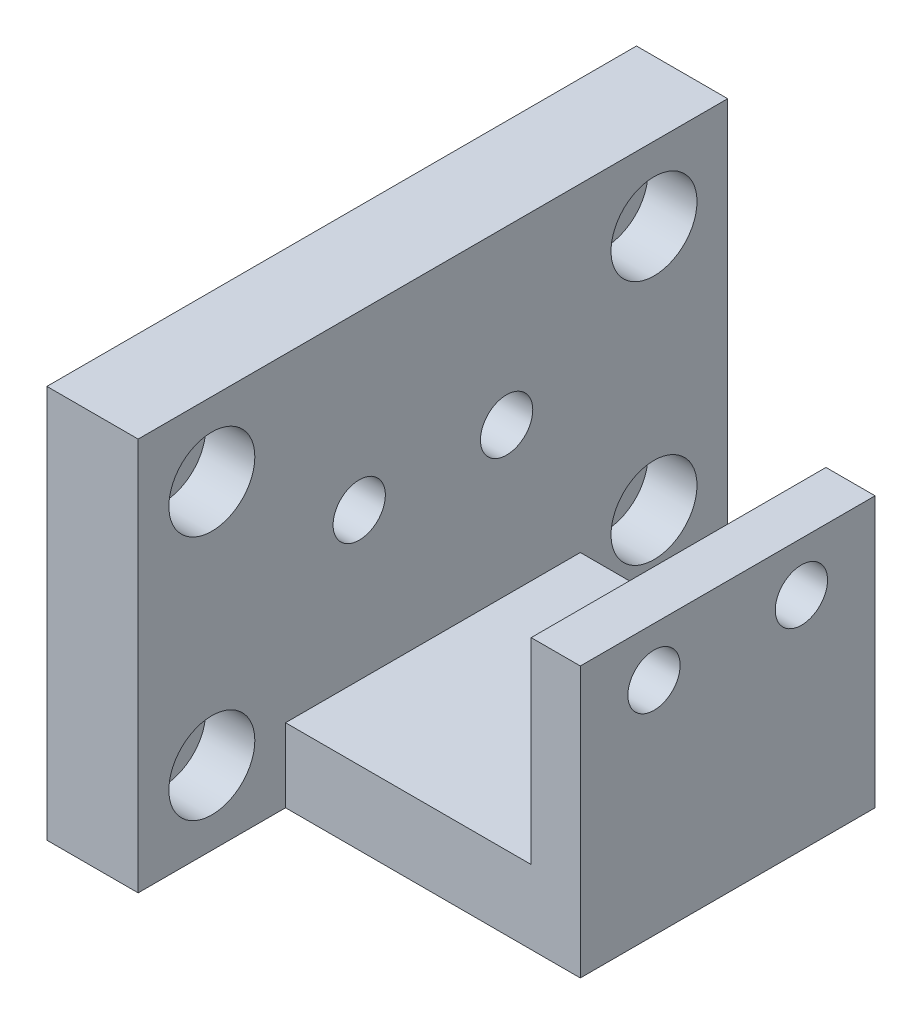
ISO-10303-21;
HEADER;
FILE_DESCRIPTION(('STEP AP214'),'2;1');
FILE_NAME('part.step','',(''),(''),'','','');
FILE_SCHEMA(('AUTOMOTIVE_DESIGN { 1 0 10303 214 1 1 1 1 }'));
ENDSEC;
DATA;
#1=APPLICATION_CONTEXT('core data for automotive mechanical design processes');
#2=APPLICATION_PROTOCOL_DEFINITION('international standard','automotive_design',2000,#1);
#3=PRODUCT_CONTEXT('',#1,'mechanical');
#4=PRODUCT('Part','Part','',(#3));
#5=PRODUCT_RELATED_PRODUCT_CATEGORY('part','',(#4));
#6=PRODUCT_DEFINITION_FORMATION('','',#4);
#7=PRODUCT_DEFINITION_CONTEXT('part definition',#1,'design');
#8=PRODUCT_DEFINITION('design','',#6,#7);
#9=PRODUCT_DEFINITION_SHAPE('','',#8);
#10=(LENGTH_UNIT() NAMED_UNIT(*) SI_UNIT(.MILLI.,.METRE.));
#11=(NAMED_UNIT(*) PLANE_ANGLE_UNIT() SI_UNIT($,.RADIAN.));
#12=(NAMED_UNIT(*) SI_UNIT($,.STERADIAN.) SOLID_ANGLE_UNIT());
#13=UNCERTAINTY_MEASURE_WITH_UNIT(LENGTH_MEASURE(1.E-05),#10,'distance_accuracy_value','');
#14=(GEOMETRIC_REPRESENTATION_CONTEXT(3) GLOBAL_UNCERTAINTY_ASSIGNED_CONTEXT((#13)) GLOBAL_UNIT_ASSIGNED_CONTEXT((#10,
#11,#12)) REPRESENTATION_CONTEXT('',''));
#15=CARTESIAN_POINT('',(0.,0.,0.));
#16=DIRECTION('',(0.,0.,1.));
#17=DIRECTION('',(1.,0.,0.));
#18=AXIS2_PLACEMENT_3D('',#15,#16,#17);
#19=CARTESIAN_POINT('',(11.7926903796541,0.,0.));
#20=DIRECTION('',(-1.,0.,0.));
#21=DIRECTION('',(0.,0.,1.));
#22=AXIS2_PLACEMENT_3D('',#19,#20,#21);
#23=PLANE('',#22);
#24=CARTESIAN_POINT('',(11.7926903796541,15.875,28.575));
#25=DIRECTION('',(1.,0.,0.));
#26=DIRECTION('',(0.,0.,-1.));
#27=AXIS2_PLACEMENT_3D('',#24,#25,#26);
#28=CIRCLE('',#27,5.55625);
#29=CARTESIAN_POINT('',(11.7926903796541,15.875,23.01875));
#30=VERTEX_POINT('',#29);
#31=EDGE_CURVE('E511',#30,#30,#28,.T.);
#32=ORIENTED_EDGE('',*,*,#31,.F.);
#33=EDGE_LOOP('',(#32));
#34=FACE_BOUND('',#33,.T.);
#35=CARTESIAN_POINT('',(11.7926903796541,15.875,-28.575));
#36=DIRECTION('',(1.,0.,0.));
#37=DIRECTION('',(0.,0.,-1.));
#38=AXIS2_PLACEMENT_3D('',#35,#36,#37);
#39=CIRCLE('',#38,5.55625);
#40=CARTESIAN_POINT('',(11.7926903796541,15.875,-34.13125));
#41=VERTEX_POINT('',#40);
#42=EDGE_CURVE('E521',#41,#41,#39,.T.);
#43=ORIENTED_EDGE('',*,*,#42,.F.);
#44=EDGE_LOOP('',(#43));
#45=FACE_BOUND('',#44,.T.);
#46=CARTESIAN_POINT('',(11.7926903796541,-15.875,-28.575));
#47=DIRECTION('',(1.,0.,0.));
#48=DIRECTION('',(0.,0.,-1.));
#49=AXIS2_PLACEMENT_3D('',#46,#47,#48);
#50=CIRCLE('',#49,5.55625);
#51=CARTESIAN_POINT('',(11.7926903796541,-15.875,-34.13125));
#52=VERTEX_POINT('',#51);
#53=EDGE_CURVE('E533',#52,#52,#50,.T.);
#54=ORIENTED_EDGE('',*,*,#53,.F.);
#55=EDGE_LOOP('',(#54));
#56=FACE_BOUND('',#55,.T.);
#57=CARTESIAN_POINT('',(11.7926903796541,3.175,9.525));
#58=DIRECTION('',(-1.,0.,0.));
#59=DIRECTION('',(0.,0.,1.));
#60=AXIS2_PLACEMENT_3D('',#57,#58,#59);
#61=CIRCLE('',#60,3.37819999999999);
#62=CARTESIAN_POINT('',(11.7926903796541,3.175,12.9032));
#63=VERTEX_POINT('',#62);
#64=EDGE_CURVE('E566',#63,#63,#61,.T.);
#65=ORIENTED_EDGE('',*,*,#64,.T.);
#66=EDGE_LOOP('',(#65));
#67=FACE_BOUND('',#66,.T.);
#68=CARTESIAN_POINT('',(11.7926903796541,3.175,-9.525));
#69=DIRECTION('',(-1.,0.,0.));
#70=DIRECTION('',(0.,0.,1.));
#71=AXIS2_PLACEMENT_3D('',#68,#69,#70);
#72=CIRCLE('',#71,3.37819999999999);
#73=CARTESIAN_POINT('',(11.7926903796541,3.175,-6.14680000000001));
#74=VERTEX_POINT('',#73);
#75=EDGE_CURVE('E575',#74,#74,#72,.T.);
#76=ORIENTED_EDGE('',*,*,#75,.T.);
#77=EDGE_LOOP('',(#76));
#78=FACE_BOUND('',#77,.T.);
#79=DIRECTION('',(0.,-1.,0.));
#80=VECTOR('',#79,1.);
#81=CARTESIAN_POINT('',(11.7926903796541,-15.875,19.05));
#82=LINE('',#81,#80);
#83=CARTESIAN_POINT('',(11.7926903796541,-15.875,19.05));
#84=VERTEX_POINT('',#83);
#85=CARTESIAN_POINT('',(11.7926903796541,-25.4,19.05));
#86=VERTEX_POINT('',#85);
#87=EDGE_CURVE('E152',#84,#86,#82,.T.);
#88=ORIENTED_EDGE('',*,*,#87,.F.);
#89=DIRECTION('',(0.,0.,1.));
#90=VECTOR('',#89,1.);
#91=CARTESIAN_POINT('',(11.7926903796541,-15.875,-19.05));
#92=LINE('',#91,#90);
#93=CARTESIAN_POINT('',(11.7926903796541,-15.875,-19.05));
#94=VERTEX_POINT('',#93);
#95=EDGE_CURVE('E167',#94,#84,#92,.T.);
#96=ORIENTED_EDGE('',*,*,#95,.F.);
#97=DIRECTION('',(0.,-1.,0.));
#98=VECTOR('',#97,1.);
#99=CARTESIAN_POINT('',(11.7926903796541,-15.875,-19.05));
#100=LINE('',#99,#98);
#101=CARTESIAN_POINT('',(11.7926903796541,-25.4,-19.05));
#102=VERTEX_POINT('',#101);
#103=EDGE_CURVE('E140',#94,#102,#100,.T.);
#104=ORIENTED_EDGE('',*,*,#103,.T.);
#105=DIRECTION('',(0.,0.,-1.));
#106=VECTOR('',#105,1.);
#107=CARTESIAN_POINT('',(11.7926903796541,-25.4,38.1));
#108=LINE('',#107,#106);
#109=CARTESIAN_POINT('',(11.7926903796541,-25.4,-38.1));
#110=VERTEX_POINT('',#109);
#111=EDGE_CURVE('E60',#102,#110,#108,.T.);
#112=ORIENTED_EDGE('',*,*,#111,.T.);
#113=DIRECTION('',(0.,1.,0.));
#114=VECTOR('',#113,1.);
#115=CARTESIAN_POINT('',(11.7926903796541,-25.4,-38.1));
#116=LINE('',#115,#114);
#117=CARTESIAN_POINT('',(11.7926903796541,25.4,-38.1));
#118=VERTEX_POINT('',#117);
#119=EDGE_CURVE('E175',#110,#118,#116,.T.);
#120=ORIENTED_EDGE('',*,*,#119,.T.);
#121=DIRECTION('',(0.,0.,1.));
#122=VECTOR('',#121,1.);
#123=CARTESIAN_POINT('',(11.7926903796541,25.4,38.1));
#124=LINE('',#123,#122);
#125=CARTESIAN_POINT('',(11.7926903796541,25.4,38.1));
#126=VERTEX_POINT('',#125);
#127=EDGE_CURVE('E89',#118,#126,#124,.T.);
#128=ORIENTED_EDGE('',*,*,#127,.T.);
#129=DIRECTION('',(0.,-1.,0.));
#130=VECTOR('',#129,1.);
#131=CARTESIAN_POINT('',(11.7926903796541,-25.4,38.1));
#132=LINE('',#131,#130);
#133=CARTESIAN_POINT('',(11.7926903796541,-25.4,38.1));
#134=VERTEX_POINT('',#133);
#135=EDGE_CURVE('E178',#126,#134,#132,.T.);
#136=ORIENTED_EDGE('',*,*,#135,.T.);
#137=EDGE_CURVE('E180',#134,#86,#108,.T.);
#138=ORIENTED_EDGE('',*,*,#137,.T.);
#139=EDGE_LOOP('',(#88,#96,#104,#112,#120,#128,#136,#138));
#140=FACE_BOUND('',#139,.T.);
#141=CARTESIAN_POINT('',(11.7926903796541,-15.875,28.575));
#142=DIRECTION('',(1.,0.,0.));
#143=DIRECTION('',(0.,0.,-1.));
#144=AXIS2_PLACEMENT_3D('',#141,#142,#143);
#145=CIRCLE('',#144,5.55625);
#146=CARTESIAN_POINT('',(11.7926903796541,-15.875,23.01875));
#147=VERTEX_POINT('',#146);
#148=EDGE_CURVE('E545',#147,#147,#145,.T.);
#149=ORIENTED_EDGE('',*,*,#148,.F.);
#150=EDGE_LOOP('',(#149));
#151=FACE_BOUND('',#150,.T.);
#152=ADVANCED_FACE('F37',(#34,#45,#56,#67,#78,#140,#151),#23,.F.);
#153=CARTESIAN_POINT('',(11.7926903796541,-25.4,-38.1));
#154=DIRECTION('',(0.,0.,1.));
#155=DIRECTION('',(1.,0.,0.));
#156=AXIS2_PLACEMENT_3D('',#153,#154,#155);
#157=PLANE('',#156);
#158=DIRECTION('',(0.,1.,0.));
#159=VECTOR('',#158,1.);
#160=CARTESIAN_POINT('',(0.,-25.4,-38.1));
#161=LINE('',#160,#159);
#162=CARTESIAN_POINT('',(0.,-25.4,-38.1));
#163=VERTEX_POINT('',#162);
#164=CARTESIAN_POINT('',(0.,25.4,-38.1));
#165=VERTEX_POINT('',#164);
#166=EDGE_CURVE('E169',#163,#165,#161,.T.);
#167=ORIENTED_EDGE('',*,*,#166,.T.);
#168=DIRECTION('',(-1.,0.,0.));
#169=VECTOR('',#168,1.);
#170=CARTESIAN_POINT('',(11.7926903796541,25.4,-38.1));
#171=LINE('',#170,#169);
#172=EDGE_CURVE('E11',#118,#165,#171,.T.);
#173=ORIENTED_EDGE('',*,*,#172,.F.);
#174=ORIENTED_EDGE('',*,*,#119,.F.);
#175=DIRECTION('',(-1.,0.,0.));
#176=VECTOR('',#175,1.);
#177=CARTESIAN_POINT('',(11.7926903796541,-25.4,-38.1));
#178=LINE('',#177,#176);
#179=EDGE_CURVE('E183',#110,#163,#178,.T.);
#180=ORIENTED_EDGE('',*,*,#179,.T.);
#181=EDGE_LOOP('',(#167,#173,#174,#180));
#182=FACE_BOUND('',#181,.T.);
#183=ADVANCED_FACE('F39',(#182),#157,.F.);
#184=CARTESIAN_POINT('',(11.7926903796541,25.4,38.1));
#185=DIRECTION('',(0.,-1.,0.));
#186=DIRECTION('',(0.,0.,-1.));
#187=AXIS2_PLACEMENT_3D('',#184,#185,#186);
#188=PLANE('',#187);
#189=DIRECTION('',(0.,0.,1.));
#190=VECTOR('',#189,1.);
#191=CARTESIAN_POINT('',(0.,25.4,38.1));
#192=LINE('',#191,#190);
#193=CARTESIAN_POINT('',(0.,25.4,38.1));
#194=VERTEX_POINT('',#193);
#195=EDGE_CURVE('E186',#165,#194,#192,.T.);
#196=ORIENTED_EDGE('',*,*,#195,.T.);
#197=DIRECTION('',(-1.,0.,0.));
#198=VECTOR('',#197,1.);
#199=CARTESIAN_POINT('',(11.7926903796541,25.4,38.1));
#200=LINE('',#199,#198);
#201=EDGE_CURVE('E45',#126,#194,#200,.T.);
#202=ORIENTED_EDGE('',*,*,#201,.F.);
#203=ORIENTED_EDGE('',*,*,#127,.F.);
#204=ORIENTED_EDGE('',*,*,#172,.T.);
#205=EDGE_LOOP('',(#196,#202,#203,#204));
#206=FACE_BOUND('',#205,.T.);
#207=ADVANCED_FACE('F238',(#206),#188,.F.);
#208=CARTESIAN_POINT('',(11.7926903796541,-25.4,38.1));
#209=DIRECTION('',(0.,0.,-1.));
#210=DIRECTION('',(-1.,0.,0.));
#211=AXIS2_PLACEMENT_3D('',#208,#209,#210);
#212=PLANE('',#211);
#213=DIRECTION('',(0.,-1.,0.));
#214=VECTOR('',#213,1.);
#215=CARTESIAN_POINT('',(0.,-25.4,38.1));
#216=LINE('',#215,#214);
#217=CARTESIAN_POINT('',(0.,-25.4,38.1));
#218=VERTEX_POINT('',#217);
#219=EDGE_CURVE('E188',#194,#218,#216,.T.);
#220=ORIENTED_EDGE('',*,*,#219,.T.);
#221=DIRECTION('',(-1.,0.,0.));
#222=VECTOR('',#221,1.);
#223=CARTESIAN_POINT('',(11.7926903796541,-25.4,38.1));
#224=LINE('',#223,#222);
#225=EDGE_CURVE('E192',#134,#218,#224,.T.);
#226=ORIENTED_EDGE('',*,*,#225,.F.);
#227=ORIENTED_EDGE('',*,*,#135,.F.);
#228=ORIENTED_EDGE('',*,*,#201,.T.);
#229=EDGE_LOOP('',(#220,#226,#227,#228));
#230=FACE_BOUND('',#229,.T.);
#231=ADVANCED_FACE('F197',(#230),#212,.F.);
#232=CARTESIAN_POINT('',(11.7926903796541,-25.4,38.1));
#233=DIRECTION('',(0.,1.,0.));
#234=DIRECTION('',(0.,0.,1.));
#235=AXIS2_PLACEMENT_3D('',#232,#233,#234);
#236=PLANE('',#235);
#237=DIRECTION('',(0.,0.,-1.));
#238=VECTOR('',#237,1.);
#239=CARTESIAN_POINT('',(0.,-25.4,38.1));
#240=LINE('',#239,#238);
#241=EDGE_CURVE('E82',#218,#163,#240,.T.);
#242=ORIENTED_EDGE('',*,*,#241,.T.);
#243=ORIENTED_EDGE('',*,*,#179,.F.);
#244=ORIENTED_EDGE('',*,*,#111,.F.);
#245=DIRECTION('',(1.,0.,0.));
#246=VECTOR('',#245,1.);
#247=CARTESIAN_POINT('',(11.7926903796541,-25.4,-19.05));
#248=LINE('',#247,#246);
#249=CARTESIAN_POINT('',(49.8926903796541,-25.4,-19.05));
#250=VERTEX_POINT('',#249);
#251=EDGE_CURVE('E52',#102,#250,#248,.T.);
#252=ORIENTED_EDGE('',*,*,#251,.T.);
#253=DIRECTION('',(0.,0.,1.));
#254=VECTOR('',#253,1.);
#255=CARTESIAN_POINT('',(49.8926903796541,-25.4,-19.05));
#256=LINE('',#255,#254);
#257=CARTESIAN_POINT('',(49.8926903796541,-25.4,19.05));
#258=VERTEX_POINT('',#257);
#259=EDGE_CURVE('E124',#250,#258,#256,.T.);
#260=ORIENTED_EDGE('',*,*,#259,.T.);
#261=DIRECTION('',(1.,0.,0.));
#262=VECTOR('',#261,1.);
#263=CARTESIAN_POINT('',(11.7926903796541,-25.4,19.05));
#264=LINE('',#263,#262);
#265=EDGE_CURVE('E155',#86,#258,#264,.T.);
#266=ORIENTED_EDGE('',*,*,#265,.F.);
#267=ORIENTED_EDGE('',*,*,#137,.F.);
#268=ORIENTED_EDGE('',*,*,#225,.T.);
#269=EDGE_LOOP('',(#242,#243,#244,#252,#260,#266,#267,#268));
#270=FACE_BOUND('',#269,.T.);
#271=ADVANCED_FACE('F139',(#270),#236,.F.);
#272=CARTESIAN_POINT('',(0.,0.,0.));
#273=DIRECTION('',(-1.,0.,0.));
#274=DIRECTION('',(0.,0.,1.));
#275=AXIS2_PLACEMENT_3D('',#272,#273,#274);
#276=PLANE('',#275);
#277=CARTESIAN_POINT('',(0.,15.875,28.575));
#278=DIRECTION('',(1.,0.,0.));
#279=DIRECTION('',(0.,0.,-1.));
#280=AXIS2_PLACEMENT_3D('',#277,#278,#279);
#281=CIRCLE('',#280,3.3782);
#282=CARTESIAN_POINT('',(0.,15.875,25.1968));
#283=VERTEX_POINT('',#282);
#284=EDGE_CURVE('E518',#283,#283,#281,.T.);
#285=ORIENTED_EDGE('',*,*,#284,.T.);
#286=EDGE_LOOP('',(#285));
#287=FACE_BOUND('',#286,.T.);
#288=CARTESIAN_POINT('',(0.,15.875,-28.575));
#289=DIRECTION('',(1.,0.,0.));
#290=DIRECTION('',(0.,0.,-1.));
#291=AXIS2_PLACEMENT_3D('',#288,#289,#290);
#292=CIRCLE('',#291,3.3782);
#293=CARTESIAN_POINT('',(0.,15.875,-31.9532));
#294=VERTEX_POINT('',#293);
#295=EDGE_CURVE('E530',#294,#294,#292,.T.);
#296=ORIENTED_EDGE('',*,*,#295,.T.);
#297=EDGE_LOOP('',(#296));
#298=FACE_BOUND('',#297,.T.);
#299=CARTESIAN_POINT('',(0.,-15.875,-28.575));
#300=DIRECTION('',(1.,0.,0.));
#301=DIRECTION('',(0.,0.,-1.));
#302=AXIS2_PLACEMENT_3D('',#299,#300,#301);
#303=CIRCLE('',#302,3.3782);
#304=CARTESIAN_POINT('',(0.,-15.875,-31.9532));
#305=VERTEX_POINT('',#304);
#306=EDGE_CURVE('E542',#305,#305,#303,.T.);
#307=ORIENTED_EDGE('',*,*,#306,.T.);
#308=EDGE_LOOP('',(#307));
#309=FACE_BOUND('',#308,.T.);
#310=CARTESIAN_POINT('',(0.,-15.875,28.575));
#311=DIRECTION('',(1.,0.,0.));
#312=DIRECTION('',(0.,0.,-1.));
#313=AXIS2_PLACEMENT_3D('',#310,#311,#312);
#314=CIRCLE('',#313,3.3782);
#315=CARTESIAN_POINT('',(0.,-15.875,25.1968));
#316=VERTEX_POINT('',#315);
#317=EDGE_CURVE('E554',#316,#316,#314,.T.);
#318=ORIENTED_EDGE('',*,*,#317,.T.);
#319=EDGE_LOOP('',(#318));
#320=FACE_BOUND('',#319,.T.);
#321=CARTESIAN_POINT('',(0.,3.175,9.525));
#322=DIRECTION('',(1.,0.,0.));
#323=DIRECTION('',(0.,0.,-1.));
#324=AXIS2_PLACEMENT_3D('',#321,#322,#323);
#325=CIRCLE('',#324,3.37819999999999);
#326=CARTESIAN_POINT('',(0.,3.175,6.14680000000001));
#327=VERTEX_POINT('',#326);
#328=EDGE_CURVE('E560',#327,#327,#325,.T.);
#329=ORIENTED_EDGE('',*,*,#328,.T.);
#330=EDGE_LOOP('',(#329));
#331=FACE_BOUND('',#330,.T.);
#332=CARTESIAN_POINT('',(0.,3.175,-9.525));
#333=DIRECTION('',(1.,0.,0.));
#334=DIRECTION('',(0.,0.,-1.));
#335=AXIS2_PLACEMENT_3D('',#332,#333,#334);
#336=CIRCLE('',#335,3.37819999999999);
#337=CARTESIAN_POINT('',(0.,3.175,-12.9032));
#338=VERTEX_POINT('',#337);
#339=EDGE_CURVE('E572',#338,#338,#336,.T.);
#340=ORIENTED_EDGE('',*,*,#339,.T.);
#341=EDGE_LOOP('',(#340));
#342=FACE_BOUND('',#341,.T.);
#343=ORIENTED_EDGE('',*,*,#166,.F.);
#344=ORIENTED_EDGE('',*,*,#241,.F.);
#345=ORIENTED_EDGE('',*,*,#219,.F.);
#346=ORIENTED_EDGE('',*,*,#195,.F.);
#347=EDGE_LOOP('',(#343,#344,#345,#346));
#348=FACE_BOUND('',#347,.T.);
#349=ADVANCED_FACE('F201',(#287,#298,#309,#320,#331,#342,#348),#276,.T.);
#350=CARTESIAN_POINT('',(43.5426903796541,-15.875,-19.05));
#351=DIRECTION('',(0.,1.,0.));
#352=DIRECTION('',(-1.,0.,0.));
#353=AXIS2_PLACEMENT_3D('',#350,#351,#352);
#354=PLANE('',#353);
#355=DIRECTION('',(-1.,0.,0.));
#356=VECTOR('',#355,1.);
#357=CARTESIAN_POINT('',(43.5426903796541,-15.875,19.05));
#358=LINE('',#357,#356);
#359=CARTESIAN_POINT('',(43.5426903796541,-15.875,19.05));
#360=VERTEX_POINT('',#359);
#361=EDGE_CURVE('E142',#360,#84,#358,.T.);
#362=ORIENTED_EDGE('',*,*,#361,.F.);
#363=DIRECTION('',(0.,0.,1.));
#364=VECTOR('',#363,1.);
#365=CARTESIAN_POINT('',(43.5426903796541,-15.875,-19.05));
#366=LINE('',#365,#364);
#367=CARTESIAN_POINT('',(43.5426903796541,-15.875,-19.05));
#368=VERTEX_POINT('',#367);
#369=EDGE_CURVE('E170',#368,#360,#366,.T.);
#370=ORIENTED_EDGE('',*,*,#369,.F.);
#371=DIRECTION('',(-1.,0.,0.));
#372=VECTOR('',#371,1.);
#373=CARTESIAN_POINT('',(43.5426903796541,-15.875,-19.05));
#374=LINE('',#373,#372);
#375=EDGE_CURVE('E131',#368,#94,#374,.T.);
#376=ORIENTED_EDGE('',*,*,#375,.T.);
#377=ORIENTED_EDGE('',*,*,#95,.T.);
#378=EDGE_LOOP('',(#362,#370,#376,#377));
#379=FACE_BOUND('',#378,.T.);
#380=ADVANCED_FACE('F213',(#379),#354,.T.);
#381=CARTESIAN_POINT('',(43.5426903796541,9.525,-19.05));
#382=DIRECTION('',(-1.,0.,0.));
#383=DIRECTION('',(0.,-1.,0.));
#384=AXIS2_PLACEMENT_3D('',#381,#382,#383);
#385=PLANE('',#384);
#386=CARTESIAN_POINT('',(43.5426903796541,3.175,9.525));
#387=DIRECTION('',(-1.,0.,0.));
#388=DIRECTION('',(0.,-1.,0.));
#389=AXIS2_PLACEMENT_3D('',#386,#387,#388);
#390=CIRCLE('',#389,3.37819999999999);
#391=CARTESIAN_POINT('',(43.5426903796541,-0.203199999999993,9.525));
#392=VERTEX_POINT('',#391);
#393=EDGE_CURVE('E563',#392,#392,#390,.T.);
#394=ORIENTED_EDGE('',*,*,#393,.F.);
#395=EDGE_LOOP('',(#394));
#396=FACE_BOUND('',#395,.T.);
#397=CARTESIAN_POINT('',(43.5426903796541,3.175,-9.525));
#398=DIRECTION('',(-1.,0.,0.));
#399=DIRECTION('',(0.,-1.,0.));
#400=AXIS2_PLACEMENT_3D('',#397,#398,#399);
#401=CIRCLE('',#400,3.37819999999999);
#402=CARTESIAN_POINT('',(43.5426903796541,-0.203199999999986,-9.525));
#403=VERTEX_POINT('',#402);
#404=EDGE_CURVE('E156',#403,#403,#401,.T.);
#405=ORIENTED_EDGE('',*,*,#404,.F.);
#406=EDGE_LOOP('',(#405));
#407=FACE_BOUND('',#406,.T.);
#408=DIRECTION('',(0.,-1.,0.));
#409=VECTOR('',#408,1.);
#410=CARTESIAN_POINT('',(43.5426903796541,9.525,19.05));
#411=LINE('',#410,#409);
#412=CARTESIAN_POINT('',(43.5426903796541,9.525,19.05));
#413=VERTEX_POINT('',#412);
#414=EDGE_CURVE('E162',#413,#360,#411,.T.);
#415=ORIENTED_EDGE('',*,*,#414,.F.);
#416=DIRECTION('',(0.,0.,1.));
#417=VECTOR('',#416,1.);
#418=CARTESIAN_POINT('',(43.5426903796541,9.525,-19.05));
#419=LINE('',#418,#417);
#420=CARTESIAN_POINT('',(43.5426903796541,9.525,-19.05));
#421=VERTEX_POINT('',#420);
#422=EDGE_CURVE('E172',#421,#413,#419,.T.);
#423=ORIENTED_EDGE('',*,*,#422,.F.);
#424=DIRECTION('',(0.,-1.,0.));
#425=VECTOR('',#424,1.);
#426=CARTESIAN_POINT('',(43.5426903796541,9.525,-19.05));
#427=LINE('',#426,#425);
#428=EDGE_CURVE('E147',#421,#368,#427,.T.);
#429=ORIENTED_EDGE('',*,*,#428,.T.);
#430=ORIENTED_EDGE('',*,*,#369,.T.);
#431=EDGE_LOOP('',(#415,#423,#429,#430));
#432=FACE_BOUND('',#431,.T.);
#433=ADVANCED_FACE('F220',(#396,#407,#432),#385,.T.);
#434=CARTESIAN_POINT('',(49.8926903796541,9.525,-19.05));
#435=DIRECTION('',(0.,1.,0.));
#436=DIRECTION('',(-1.,0.,0.));
#437=AXIS2_PLACEMENT_3D('',#434,#435,#436);
#438=PLANE('',#437);
#439=DIRECTION('',(-1.,0.,0.));
#440=VECTOR('',#439,1.);
#441=CARTESIAN_POINT('',(49.8926903796541,9.525,19.05));
#442=LINE('',#441,#440);
#443=CARTESIAN_POINT('',(49.8926903796541,9.525,19.05));
#444=VERTEX_POINT('',#443);
#445=EDGE_CURVE('E159',#444,#413,#442,.T.);
#446=ORIENTED_EDGE('',*,*,#445,.F.);
#447=DIRECTION('',(0.,0.,1.));
#448=VECTOR('',#447,1.);
#449=CARTESIAN_POINT('',(49.8926903796541,9.525,-19.05));
#450=LINE('',#449,#448);
#451=CARTESIAN_POINT('',(49.8926903796541,9.525,-19.05));
#452=VERTEX_POINT('',#451);
#453=EDGE_CURVE('E130',#452,#444,#450,.T.);
#454=ORIENTED_EDGE('',*,*,#453,.F.);
#455=DIRECTION('',(-1.,0.,0.));
#456=VECTOR('',#455,1.);
#457=CARTESIAN_POINT('',(49.8926903796541,9.525,-19.05));
#458=LINE('',#457,#456);
#459=EDGE_CURVE('E137',#452,#421,#458,.T.);
#460=ORIENTED_EDGE('',*,*,#459,.T.);
#461=ORIENTED_EDGE('',*,*,#422,.T.);
#462=EDGE_LOOP('',(#446,#454,#460,#461));
#463=FACE_BOUND('',#462,.T.);
#464=ADVANCED_FACE('F218',(#463),#438,.T.);
#465=CARTESIAN_POINT('',(49.8926903796541,-25.4,-19.05));
#466=DIRECTION('',(1.,0.,0.));
#467=DIRECTION('',(0.,1.,0.));
#468=AXIS2_PLACEMENT_3D('',#465,#466,#467);
#469=PLANE('',#468);
#470=CARTESIAN_POINT('',(49.8926903796541,3.175,9.525));
#471=DIRECTION('',(1.,0.,0.));
#472=DIRECTION('',(0.,0.,-1.));
#473=AXIS2_PLACEMENT_3D('',#470,#471,#472);
#474=CIRCLE('',#473,3.37819999999999);
#475=CARTESIAN_POINT('',(49.8926903796541,3.175,6.14680000000001));
#476=VERTEX_POINT('',#475);
#477=EDGE_CURVE('E557',#476,#476,#474,.T.);
#478=ORIENTED_EDGE('',*,*,#477,.F.);
#479=EDGE_LOOP('',(#478));
#480=FACE_BOUND('',#479,.T.);
#481=CARTESIAN_POINT('',(49.8926903796541,3.175,-9.525));
#482=DIRECTION('',(1.,0.,0.));
#483=DIRECTION('',(0.,0.,-1.));
#484=AXIS2_PLACEMENT_3D('',#481,#482,#483);
#485=CIRCLE('',#484,3.37819999999999);
#486=CARTESIAN_POINT('',(49.8926903796541,3.175,-12.9032));
#487=VERTEX_POINT('',#486);
#488=EDGE_CURVE('E569',#487,#487,#485,.T.);
#489=ORIENTED_EDGE('',*,*,#488,.F.);
#490=EDGE_LOOP('',(#489));
#491=FACE_BOUND('',#490,.T.);
#492=DIRECTION('',(0.,1.,0.));
#493=VECTOR('',#492,1.);
#494=CARTESIAN_POINT('',(49.8926903796541,-25.4,19.05));
#495=LINE('',#494,#493);
#496=EDGE_CURVE('E128',#258,#444,#495,.T.);
#497=ORIENTED_EDGE('',*,*,#496,.F.);
#498=ORIENTED_EDGE('',*,*,#259,.F.);
#499=DIRECTION('',(0.,1.,0.));
#500=VECTOR('',#499,1.);
#501=CARTESIAN_POINT('',(49.8926903796541,-25.4,-19.05));
#502=LINE('',#501,#500);
#503=EDGE_CURVE('E126',#250,#452,#502,.T.);
#504=ORIENTED_EDGE('',*,*,#503,.T.);
#505=ORIENTED_EDGE('',*,*,#453,.T.);
#506=EDGE_LOOP('',(#497,#498,#504,#505));
#507=FACE_BOUND('',#506,.T.);
#508=ADVANCED_FACE('F125',(#480,#491,#507),#469,.T.);
#509=CARTESIAN_POINT('',(0.,0.,-19.05));
#510=DIRECTION('',(0.,0.,1.));
#511=DIRECTION('',(1.,0.,0.));
#512=AXIS2_PLACEMENT_3D('',#509,#510,#511);
#513=PLANE('',#512);
#514=ORIENTED_EDGE('',*,*,#103,.F.);
#515=ORIENTED_EDGE('',*,*,#375,.F.);
#516=ORIENTED_EDGE('',*,*,#428,.F.);
#517=ORIENTED_EDGE('',*,*,#459,.F.);
#518=ORIENTED_EDGE('',*,*,#503,.F.);
#519=ORIENTED_EDGE('',*,*,#251,.F.);
#520=EDGE_LOOP('',(#514,#515,#516,#517,#518,#519));
#521=FACE_BOUND('',#520,.T.);
#522=ADVANCED_FACE('F134',(#521),#513,.F.);
#523=CARTESIAN_POINT('',(0.,0.,19.05));
#524=DIRECTION('',(0.,0.,1.));
#525=DIRECTION('',(1.,0.,0.));
#526=AXIS2_PLACEMENT_3D('',#523,#524,#525);
#527=PLANE('',#526);
#528=ORIENTED_EDGE('',*,*,#87,.T.);
#529=ORIENTED_EDGE('',*,*,#265,.T.);
#530=ORIENTED_EDGE('',*,*,#496,.T.);
#531=ORIENTED_EDGE('',*,*,#445,.T.);
#532=ORIENTED_EDGE('',*,*,#414,.T.);
#533=ORIENTED_EDGE('',*,*,#361,.T.);
#534=EDGE_LOOP('',(#528,#529,#530,#531,#532,#533));
#535=FACE_BOUND('',#534,.T.);
#536=ADVANCED_FACE('F209',(#535),#527,.T.);
#537=CARTESIAN_POINT('',(49.8926903796541,3.175,-9.525));
#538=DIRECTION('',(1.,0.,0.));
#539=DIRECTION('',(0.,0.,-1.));
#540=AXIS2_PLACEMENT_3D('',#537,#538,#539);
#541=CYLINDRICAL_SURFACE('',#540,3.37819999999999);
#542=ORIENTED_EDGE('',*,*,#404,.T.);
#543=EDGE_LOOP('',(#542));
#544=FACE_BOUND('',#543,.T.);
#545=ORIENTED_EDGE('',*,*,#488,.T.);
#546=EDGE_LOOP('',(#545));
#547=FACE_BOUND('',#546,.T.);
#548=ADVANCED_FACE('F299',(#544,#547),#541,.F.);
#549=ORIENTED_EDGE('',*,*,#339,.F.);
#550=EDGE_LOOP('',(#549));
#551=FACE_BOUND('',#550,.T.);
#552=ORIENTED_EDGE('',*,*,#75,.F.);
#553=EDGE_LOOP('',(#552));
#554=FACE_BOUND('',#553,.T.);
#555=ADVANCED_FACE('F321',(#551,#554),#541,.F.);
#556=CARTESIAN_POINT('',(49.8926903796541,3.175,9.525));
#557=DIRECTION('',(1.,0.,0.));
#558=DIRECTION('',(0.,0.,-1.));
#559=AXIS2_PLACEMENT_3D('',#556,#557,#558);
#560=CYLINDRICAL_SURFACE('',#559,3.37819999999999);
#561=ORIENTED_EDGE('',*,*,#393,.T.);
#562=EDGE_LOOP('',(#561));
#563=FACE_BOUND('',#562,.T.);
#564=ORIENTED_EDGE('',*,*,#477,.T.);
#565=EDGE_LOOP('',(#564));
#566=FACE_BOUND('',#565,.T.);
#567=ADVANCED_FACE('F332',(#563,#566),#560,.F.);
#568=ORIENTED_EDGE('',*,*,#328,.F.);
#569=EDGE_LOOP('',(#568));
#570=FACE_BOUND('',#569,.T.);
#571=ORIENTED_EDGE('',*,*,#64,.F.);
#572=EDGE_LOOP('',(#571));
#573=FACE_BOUND('',#572,.T.);
#574=ADVANCED_FACE('F342',(#570,#573),#560,.F.);
#575=CARTESIAN_POINT('',(11.7926903796541,-15.875,28.575));
#576=DIRECTION('',(1.,0.,0.));
#577=DIRECTION('',(0.,0.,-1.));
#578=AXIS2_PLACEMENT_3D('',#575,#576,#577);
#579=CYLINDRICAL_SURFACE('',#578,3.3782);
#580=ORIENTED_EDGE('',*,*,#317,.F.);
#581=EDGE_LOOP('',(#580));
#582=FACE_BOUND('',#581,.T.);
#583=CARTESIAN_POINT('',(5.44269037965411,-15.875,28.575));
#584=DIRECTION('',(1.,0.,0.));
#585=DIRECTION('',(0.,0.,-1.));
#586=AXIS2_PLACEMENT_3D('',#583,#584,#585);
#587=CIRCLE('',#586,3.3782);
#588=CARTESIAN_POINT('',(5.44269037965411,-15.875,25.1968));
#589=VERTEX_POINT('',#588);
#590=EDGE_CURVE('E551',#589,#589,#587,.T.);
#591=ORIENTED_EDGE('',*,*,#590,.T.);
#592=EDGE_LOOP('',(#591));
#593=FACE_BOUND('',#592,.T.);
#594=ADVANCED_FACE('F352',(#582,#593),#579,.F.);
#595=CARTESIAN_POINT('',(5.44269037965411,-12.4968,28.575));
#596=DIRECTION('',(-1.,0.,0.));
#597=DIRECTION('',(0.,0.,1.));
#598=AXIS2_PLACEMENT_3D('',#595,#596,#597);
#599=PLANE('',#598);
#600=ORIENTED_EDGE('',*,*,#590,.F.);
#601=EDGE_LOOP('',(#600));
#602=FACE_BOUND('',#601,.T.);
#603=CARTESIAN_POINT('',(5.44269037965411,-15.875,28.575));
#604=DIRECTION('',(1.,0.,0.));
#605=DIRECTION('',(0.,0.,-1.));
#606=AXIS2_PLACEMENT_3D('',#603,#604,#605);
#607=CIRCLE('',#606,5.55625);
#608=CARTESIAN_POINT('',(5.44269037965411,-15.875,23.01875));
#609=VERTEX_POINT('',#608);
#610=EDGE_CURVE('E548',#609,#609,#607,.T.);
#611=ORIENTED_EDGE('',*,*,#610,.T.);
#612=EDGE_LOOP('',(#611));
#613=FACE_BOUND('',#612,.T.);
#614=ADVANCED_FACE('F370',(#602,#613),#599,.F.);
#615=CARTESIAN_POINT('',(11.7926903796541,-15.875,28.575));
#616=DIRECTION('',(1.,0.,0.));
#617=DIRECTION('',(0.,0.,-1.));
#618=AXIS2_PLACEMENT_3D('',#615,#616,#617);
#619=CYLINDRICAL_SURFACE('',#618,5.55625);
#620=ORIENTED_EDGE('',*,*,#610,.F.);
#621=EDGE_LOOP('',(#620));
#622=FACE_BOUND('',#621,.T.);
#623=ORIENTED_EDGE('',*,*,#148,.T.);
#624=EDGE_LOOP('',(#623));
#625=FACE_BOUND('',#624,.T.);
#626=ADVANCED_FACE('F381',(#622,#625),#619,.F.);
#627=CARTESIAN_POINT('',(11.7926903796541,-15.875,-28.575));
#628=DIRECTION('',(1.,0.,0.));
#629=DIRECTION('',(0.,0.,-1.));
#630=AXIS2_PLACEMENT_3D('',#627,#628,#629);
#631=CYLINDRICAL_SURFACE('',#630,3.3782);
#632=ORIENTED_EDGE('',*,*,#306,.F.);
#633=EDGE_LOOP('',(#632));
#634=FACE_BOUND('',#633,.T.);
#635=CARTESIAN_POINT('',(5.44269037965411,-15.875,-28.575));
#636=DIRECTION('',(1.,0.,0.));
#637=DIRECTION('',(0.,0.,-1.));
#638=AXIS2_PLACEMENT_3D('',#635,#636,#637);
#639=CIRCLE('',#638,3.3782);
#640=CARTESIAN_POINT('',(5.44269037965411,-15.875,-31.9532));
#641=VERTEX_POINT('',#640);
#642=EDGE_CURVE('E539',#641,#641,#639,.T.);
#643=ORIENTED_EDGE('',*,*,#642,.T.);
#644=EDGE_LOOP('',(#643));
#645=FACE_BOUND('',#644,.T.);
#646=ADVANCED_FACE('F392',(#634,#645),#631,.F.);
#647=CARTESIAN_POINT('',(5.44269037965411,-12.4968,-28.575));
#648=DIRECTION('',(-1.,0.,0.));
#649=DIRECTION('',(0.,0.,1.));
#650=AXIS2_PLACEMENT_3D('',#647,#648,#649);
#651=PLANE('',#650);
#652=ORIENTED_EDGE('',*,*,#642,.F.);
#653=EDGE_LOOP('',(#652));
#654=FACE_BOUND('',#653,.T.);
#655=CARTESIAN_POINT('',(5.44269037965411,-15.875,-28.575));
#656=DIRECTION('',(1.,0.,0.));
#657=DIRECTION('',(0.,0.,-1.));
#658=AXIS2_PLACEMENT_3D('',#655,#656,#657);
#659=CIRCLE('',#658,5.55625);
#660=CARTESIAN_POINT('',(5.44269037965411,-15.875,-34.13125));
#661=VERTEX_POINT('',#660);
#662=EDGE_CURVE('E536',#661,#661,#659,.T.);
#663=ORIENTED_EDGE('',*,*,#662,.T.);
#664=EDGE_LOOP('',(#663));
#665=FACE_BOUND('',#664,.T.);
#666=ADVANCED_FACE('F403',(#654,#665),#651,.F.);
#667=CARTESIAN_POINT('',(11.7926903796541,-15.875,-28.575));
#668=DIRECTION('',(1.,0.,0.));
#669=DIRECTION('',(0.,0.,-1.));
#670=AXIS2_PLACEMENT_3D('',#667,#668,#669);
#671=CYLINDRICAL_SURFACE('',#670,5.55625);
#672=ORIENTED_EDGE('',*,*,#662,.F.);
#673=EDGE_LOOP('',(#672));
#674=FACE_BOUND('',#673,.T.);
#675=ORIENTED_EDGE('',*,*,#53,.T.);
#676=EDGE_LOOP('',(#675));
#677=FACE_BOUND('',#676,.T.);
#678=ADVANCED_FACE('F414',(#674,#677),#671,.F.);
#679=CARTESIAN_POINT('',(11.7926903796541,15.875,-28.575));
#680=DIRECTION('',(1.,0.,0.));
#681=DIRECTION('',(0.,0.,-1.));
#682=AXIS2_PLACEMENT_3D('',#679,#680,#681);
#683=CYLINDRICAL_SURFACE('',#682,3.3782);
#684=ORIENTED_EDGE('',*,*,#295,.F.);
#685=EDGE_LOOP('',(#684));
#686=FACE_BOUND('',#685,.T.);
#687=CARTESIAN_POINT('',(5.44269037965411,15.875,-28.575));
#688=DIRECTION('',(1.,0.,0.));
#689=DIRECTION('',(0.,0.,-1.));
#690=AXIS2_PLACEMENT_3D('',#687,#688,#689);
#691=CIRCLE('',#690,3.3782);
#692=CARTESIAN_POINT('',(5.44269037965411,15.875,-31.9532));
#693=VERTEX_POINT('',#692);
#694=EDGE_CURVE('E527',#693,#693,#691,.T.);
#695=ORIENTED_EDGE('',*,*,#694,.T.);
#696=EDGE_LOOP('',(#695));
#697=FACE_BOUND('',#696,.T.);
#698=ADVANCED_FACE('F425',(#686,#697),#683,.F.);
#699=CARTESIAN_POINT('',(5.44269037965411,19.2532,-28.575));
#700=DIRECTION('',(-1.,0.,0.));
#701=DIRECTION('',(0.,0.,1.));
#702=AXIS2_PLACEMENT_3D('',#699,#700,#701);
#703=PLANE('',#702);
#704=ORIENTED_EDGE('',*,*,#694,.F.);
#705=EDGE_LOOP('',(#704));
#706=FACE_BOUND('',#705,.T.);
#707=CARTESIAN_POINT('',(5.44269037965411,15.875,-28.575));
#708=DIRECTION('',(1.,0.,0.));
#709=DIRECTION('',(0.,0.,-1.));
#710=AXIS2_PLACEMENT_3D('',#707,#708,#709);
#711=CIRCLE('',#710,5.55625);
#712=CARTESIAN_POINT('',(5.44269037965411,15.875,-34.13125));
#713=VERTEX_POINT('',#712);
#714=EDGE_CURVE('E524',#713,#713,#711,.T.);
#715=ORIENTED_EDGE('',*,*,#714,.T.);
#716=EDGE_LOOP('',(#715));
#717=FACE_BOUND('',#716,.T.);
#718=ADVANCED_FACE('F436',(#706,#717),#703,.F.);
#719=CARTESIAN_POINT('',(11.7926903796541,15.875,-28.575));
#720=DIRECTION('',(1.,0.,0.));
#721=DIRECTION('',(0.,0.,-1.));
#722=AXIS2_PLACEMENT_3D('',#719,#720,#721);
#723=CYLINDRICAL_SURFACE('',#722,5.55625);
#724=ORIENTED_EDGE('',*,*,#714,.F.);
#725=EDGE_LOOP('',(#724));
#726=FACE_BOUND('',#725,.T.);
#727=ORIENTED_EDGE('',*,*,#42,.T.);
#728=EDGE_LOOP('',(#727));
#729=FACE_BOUND('',#728,.T.);
#730=ADVANCED_FACE('F447',(#726,#729),#723,.F.);
#731=CARTESIAN_POINT('',(11.7926903796541,15.875,28.575));
#732=DIRECTION('',(1.,0.,0.));
#733=DIRECTION('',(0.,0.,-1.));
#734=AXIS2_PLACEMENT_3D('',#731,#732,#733);
#735=CYLINDRICAL_SURFACE('',#734,3.3782);
#736=ORIENTED_EDGE('',*,*,#284,.F.);
#737=EDGE_LOOP('',(#736));
#738=FACE_BOUND('',#737,.T.);
#739=CARTESIAN_POINT('',(5.44269037965411,15.875,28.575));
#740=DIRECTION('',(1.,0.,0.));
#741=DIRECTION('',(0.,0.,-1.));
#742=AXIS2_PLACEMENT_3D('',#739,#740,#741);
#743=CIRCLE('',#742,3.3782);
#744=CARTESIAN_POINT('',(5.44269037965411,15.875,25.1968));
#745=VERTEX_POINT('',#744);
#746=EDGE_CURVE('E513',#745,#745,#743,.T.);
#747=ORIENTED_EDGE('',*,*,#746,.T.);
#748=EDGE_LOOP('',(#747));
#749=FACE_BOUND('',#748,.T.);
#750=ADVANCED_FACE('F458',(#738,#749),#735,.F.);
#751=CARTESIAN_POINT('',(5.44269037965411,19.2532,28.575));
#752=DIRECTION('',(-1.,0.,0.));
#753=DIRECTION('',(0.,0.,1.));
#754=AXIS2_PLACEMENT_3D('',#751,#752,#753);
#755=PLANE('',#754);
#756=ORIENTED_EDGE('',*,*,#746,.F.);
#757=EDGE_LOOP('',(#756));
#758=FACE_BOUND('',#757,.T.);
#759=CARTESIAN_POINT('',(5.44269037965411,15.875,28.575));
#760=DIRECTION('',(1.,0.,0.));
#761=DIRECTION('',(0.,0.,-1.));
#762=AXIS2_PLACEMENT_3D('',#759,#760,#761);
#763=CIRCLE('',#762,5.55625);
#764=CARTESIAN_POINT('',(5.44269037965411,15.875,23.01875));
#765=VERTEX_POINT('',#764);
#766=EDGE_CURVE('E509',#765,#765,#763,.T.);
#767=ORIENTED_EDGE('',*,*,#766,.T.);
#768=EDGE_LOOP('',(#767));
#769=FACE_BOUND('',#768,.T.);
#770=ADVANCED_FACE('F469',(#758,#769),#755,.F.);
#771=CARTESIAN_POINT('',(11.7926903796541,15.875,28.575));
#772=DIRECTION('',(1.,0.,0.));
#773=DIRECTION('',(0.,0.,-1.));
#774=AXIS2_PLACEMENT_3D('',#771,#772,#773);
#775=CYLINDRICAL_SURFACE('',#774,5.55625);
#776=ORIENTED_EDGE('',*,*,#766,.F.);
#777=EDGE_LOOP('',(#776));
#778=FACE_BOUND('',#777,.T.);
#779=ORIENTED_EDGE('',*,*,#31,.T.);
#780=EDGE_LOOP('',(#779));
#781=FACE_BOUND('',#780,.T.);
#782=ADVANCED_FACE('F480',(#778,#781),#775,.F.);
#783=CLOSED_SHELL('',(#152,#183,#207,#231,#271,#349,#380,#433,#464,#508,#522,#536,#548,#555,
#567,#574,#594,#614,#626,#646,#666,#678,#698,#718,#730,#750,#770,#782));
#784=MANIFOLD_SOLID_BREP('B2',#783);
#785=ADVANCED_BREP_SHAPE_REPRESENTATION('',(#18,#784),#14);
#786=SHAPE_DEFINITION_REPRESENTATION(#9,#785);
ENDSEC;
END-ISO-10303-21;
